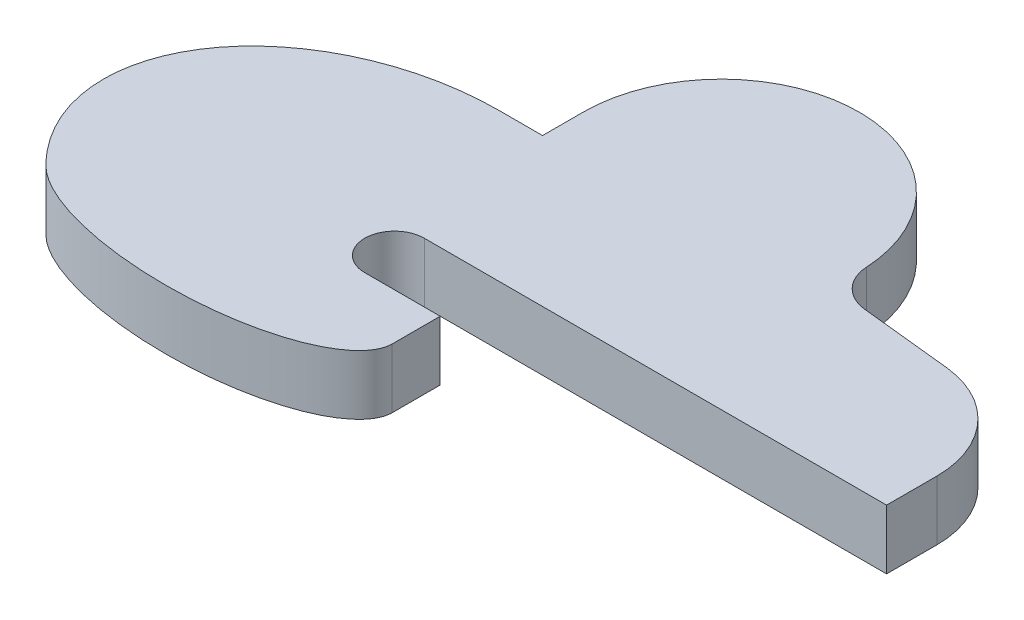
ISO-10303-21;
HEADER;
FILE_DESCRIPTION(('STEP AP214'),'2;1');
FILE_NAME('part.step','',(''),(''),'','','');
FILE_SCHEMA(('AUTOMOTIVE_DESIGN { 1 0 10303 214 1 1 1 1 }'));
ENDSEC;
DATA;
#1=APPLICATION_CONTEXT('core data for automotive mechanical design processes');
#2=APPLICATION_PROTOCOL_DEFINITION('international standard','automotive_design',2000,#1);
#3=PRODUCT_CONTEXT('',#1,'mechanical');
#4=PRODUCT('Part','Part','',(#3));
#5=PRODUCT_RELATED_PRODUCT_CATEGORY('part','',(#4));
#6=PRODUCT_DEFINITION_FORMATION('','',#4);
#7=PRODUCT_DEFINITION_CONTEXT('part definition',#1,'design');
#8=PRODUCT_DEFINITION('design','',#6,#7);
#9=PRODUCT_DEFINITION_SHAPE('','',#8);
#10=(LENGTH_UNIT() NAMED_UNIT(*) SI_UNIT(.MILLI.,.METRE.));
#11=(NAMED_UNIT(*) PLANE_ANGLE_UNIT() SI_UNIT($,.RADIAN.));
#12=(NAMED_UNIT(*) SI_UNIT($,.STERADIAN.) SOLID_ANGLE_UNIT());
#13=UNCERTAINTY_MEASURE_WITH_UNIT(LENGTH_MEASURE(1.E-05),#10,'distance_accuracy_value','');
#14=(GEOMETRIC_REPRESENTATION_CONTEXT(3) GLOBAL_UNCERTAINTY_ASSIGNED_CONTEXT((#13)) GLOBAL_UNIT_ASSIGNED_CONTEXT((#10,
#11,#12)) REPRESENTATION_CONTEXT('',''));
#15=CARTESIAN_POINT('',(0.,0.,0.));
#16=DIRECTION('',(0.,0.,1.));
#17=DIRECTION('',(1.,0.,0.));
#18=AXIS2_PLACEMENT_3D('',#15,#16,#17);
#19=CARTESIAN_POINT('',(0.,3.,2.42106019412781));
#20=DIRECTION('',(-1.,0.,0.));
#21=DIRECTION('',(0.,0.,1.));
#22=AXIS2_PLACEMENT_3D('',#19,#20,#21);
#23=PLANE('',#22);
#24=DIRECTION('',(0.,0.,-1.));
#25=VECTOR('',#24,1.);
#26=CARTESIAN_POINT('',(0.,0.,2.42106019412781));
#27=LINE('',#26,#25);
#28=CARTESIAN_POINT('',(0.,0.,2.42106019412781));
#29=VERTEX_POINT('',#28);
#30=CARTESIAN_POINT('',(0.,0.,0.));
#31=VERTEX_POINT('',#30);
#32=EDGE_CURVE('E215',#29,#31,#27,.T.);
#33=ORIENTED_EDGE('',*,*,#32,.T.);
#34=DIRECTION('',(0.,-1.,0.));
#35=VECTOR('',#34,1.);
#36=CARTESIAN_POINT('',(0.,3.,0.));
#37=LINE('',#36,#35);
#38=CARTESIAN_POINT('',(0.,3.,0.));
#39=VERTEX_POINT('',#38);
#40=EDGE_CURVE('E11',#39,#31,#37,.T.);
#41=ORIENTED_EDGE('',*,*,#40,.F.);
#42=DIRECTION('',(0.,0.,-1.));
#43=VECTOR('',#42,1.);
#44=CARTESIAN_POINT('',(0.,3.,2.42106019412781));
#45=LINE('',#44,#43);
#46=CARTESIAN_POINT('',(0.,3.,2.42106019412781));
#47=VERTEX_POINT('',#46);
#48=EDGE_CURVE('E243',#47,#39,#45,.T.);
#49=ORIENTED_EDGE('',*,*,#48,.F.);
#50=DIRECTION('',(0.,-1.,0.));
#51=VECTOR('',#50,1.);
#52=CARTESIAN_POINT('',(0.,3.,2.42106019412781));
#53=LINE('',#52,#51);
#54=EDGE_CURVE('E155',#47,#29,#53,.T.);
#55=ORIENTED_EDGE('',*,*,#54,.T.);
#56=EDGE_LOOP('',(#33,#41,#49,#55));
#57=FACE_BOUND('',#56,.T.);
#58=ADVANCED_FACE('F33',(#57),#23,.F.);
#59=CARTESIAN_POINT('',(0.,3.,0.));
#60=DIRECTION('',(0.,0.,1.));
#61=DIRECTION('',(1.,0.,0.));
#62=AXIS2_PLACEMENT_3D('',#59,#60,#61);
#63=PLANE('',#62);
#64=DIRECTION('',(-1.,0.,0.));
#65=VECTOR('',#64,1.);
#66=CARTESIAN_POINT('',(0.,0.,0.));
#67=LINE('',#66,#65);
#68=CARTESIAN_POINT('',(-3.8,0.,0.));
#69=VERTEX_POINT('',#68);
#70=EDGE_CURVE('E206',#31,#69,#67,.T.);
#71=ORIENTED_EDGE('',*,*,#70,.T.);
#72=DIRECTION('',(0.,-1.,0.));
#73=VECTOR('',#72,1.);
#74=CARTESIAN_POINT('',(-3.8,3.,0.));
#75=LINE('',#74,#73);
#76=CARTESIAN_POINT('',(-3.8,3.,0.));
#77=VERTEX_POINT('',#76);
#78=EDGE_CURVE('E41',#77,#69,#75,.T.);
#79=ORIENTED_EDGE('',*,*,#78,.F.);
#80=DIRECTION('',(-1.,0.,0.));
#81=VECTOR('',#80,1.);
#82=CARTESIAN_POINT('',(0.,3.,0.));
#83=LINE('',#82,#81);
#84=EDGE_CURVE('E107',#39,#77,#83,.T.);
#85=ORIENTED_EDGE('',*,*,#84,.F.);
#86=ORIENTED_EDGE('',*,*,#40,.T.);
#87=EDGE_LOOP('',(#71,#79,#85,#86));
#88=FACE_BOUND('',#87,.T.);
#89=ADVANCED_FACE('F199',(#88),#63,.F.);
#90=CARTESIAN_POINT('',(-3.8,3.,-1.5));
#91=DIRECTION('',(0.,-1.,0.));
#92=DIRECTION('',(0.,0.,-1.));
#93=AXIS2_PLACEMENT_3D('',#90,#91,#92);
#94=CYLINDRICAL_SURFACE('',#93,1.5);
#95=CARTESIAN_POINT('',(-3.8,0.,-1.5));
#96=DIRECTION('',(0.,-1.,0.));
#97=DIRECTION('',(0.,0.,-1.));
#98=AXIS2_PLACEMENT_3D('',#95,#96,#97);
#99=CIRCLE('',#98,1.5);
#100=CARTESIAN_POINT('',(-3.8,0.,-3.));
#101=VERTEX_POINT('',#100);
#102=EDGE_CURVE('E214',#69,#101,#99,.T.);
#103=ORIENTED_EDGE('',*,*,#102,.T.);
#104=DIRECTION('',(0.,-1.,0.));
#105=VECTOR('',#104,1.);
#106=CARTESIAN_POINT('',(-3.8,3.,-3.));
#107=LINE('',#106,#105);
#108=CARTESIAN_POINT('',(-3.8,3.,-3.));
#109=VERTEX_POINT('',#108);
#110=EDGE_CURVE('E220',#109,#101,#107,.T.);
#111=ORIENTED_EDGE('',*,*,#110,.F.);
#112=CARTESIAN_POINT('',(-3.8,3.,-1.5));
#113=DIRECTION('',(0.,-1.,0.));
#114=DIRECTION('',(0.,0.,-1.));
#115=AXIS2_PLACEMENT_3D('',#112,#113,#114);
#116=CIRCLE('',#115,1.5);
#117=EDGE_CURVE('E219',#77,#109,#116,.T.);
#118=ORIENTED_EDGE('',*,*,#117,.F.);
#119=ORIENTED_EDGE('',*,*,#78,.T.);
#120=EDGE_LOOP('',(#103,#111,#118,#119));
#121=FACE_BOUND('',#120,.T.);
#122=ADVANCED_FACE('F196',(#121),#94,.F.);
#123=CARTESIAN_POINT('',(-3.8,3.,-3.));
#124=DIRECTION('',(0.,0.,-1.));
#125=DIRECTION('',(-1.,0.,0.));
#126=AXIS2_PLACEMENT_3D('',#123,#124,#125);
#127=PLANE('',#126);
#128=DIRECTION('',(1.,0.,0.));
#129=VECTOR('',#128,1.);
#130=CARTESIAN_POINT('',(-3.8,0.,-3.));
#131=LINE('',#130,#129);
#132=CARTESIAN_POINT('',(19.47,0.,-3.));
#133=VERTEX_POINT('',#132);
#134=EDGE_CURVE('E224',#101,#133,#131,.T.);
#135=ORIENTED_EDGE('',*,*,#134,.T.);
#136=DIRECTION('',(0.,-1.,0.));
#137=VECTOR('',#136,1.);
#138=CARTESIAN_POINT('',(19.47,3.,-3.));
#139=LINE('',#138,#137);
#140=CARTESIAN_POINT('',(19.47,3.,-3.));
#141=VERTEX_POINT('',#140);
#142=EDGE_CURVE('E262',#141,#133,#139,.T.);
#143=ORIENTED_EDGE('',*,*,#142,.F.);
#144=DIRECTION('',(1.,0.,0.));
#145=VECTOR('',#144,1.);
#146=CARTESIAN_POINT('',(-3.8,3.,-3.));
#147=LINE('',#146,#145);
#148=EDGE_CURVE('E267',#109,#141,#147,.T.);
#149=ORIENTED_EDGE('',*,*,#148,.F.);
#150=ORIENTED_EDGE('',*,*,#110,.T.);
#151=EDGE_LOOP('',(#135,#143,#149,#150));
#152=FACE_BOUND('',#151,.T.);
#153=ADVANCED_FACE('F192',(#152),#127,.F.);
#154=CARTESIAN_POINT('',(19.47,3.,-3.));
#155=DIRECTION('',(-1.,0.,0.));
#156=DIRECTION('',(0.,0.,1.));
#157=AXIS2_PLACEMENT_3D('',#154,#155,#156);
#158=PLANE('',#157);
#159=DIRECTION('',(0.,0.,-1.));
#160=VECTOR('',#159,1.);
#161=CARTESIAN_POINT('',(19.47,0.,-3.));
#162=LINE('',#161,#160);
#163=CARTESIAN_POINT('',(19.47,0.,-5.53113056743434));
#164=VERTEX_POINT('',#163);
#165=EDGE_CURVE('E226',#133,#164,#162,.T.);
#166=ORIENTED_EDGE('',*,*,#165,.T.);
#167=DIRECTION('',(0.,-1.,0.));
#168=VECTOR('',#167,1.);
#169=CARTESIAN_POINT('',(19.47,3.,-5.53113056743434));
#170=LINE('',#169,#168);
#171=CARTESIAN_POINT('',(19.47,3.,-5.53113056743434));
#172=VERTEX_POINT('',#171);
#173=EDGE_CURVE('E259',#172,#164,#170,.T.);
#174=ORIENTED_EDGE('',*,*,#173,.F.);
#175=DIRECTION('',(0.,0.,-1.));
#176=VECTOR('',#175,1.);
#177=CARTESIAN_POINT('',(19.47,3.,-3.));
#178=LINE('',#177,#176);
#179=EDGE_CURVE('E269',#141,#172,#178,.T.);
#180=ORIENTED_EDGE('',*,*,#179,.F.);
#181=ORIENTED_EDGE('',*,*,#142,.T.);
#182=EDGE_LOOP('',(#166,#174,#180,#181));
#183=FACE_BOUND('',#182,.T.);
#184=ADVANCED_FACE('F188',(#183),#158,.F.);
#185=CARTESIAN_POINT('',(14.47,3.,-5.53113056743434));
#186=DIRECTION('',(0.,-1.,0.));
#187=DIRECTION('',(0.,0.,-1.));
#188=AXIS2_PLACEMENT_3D('',#185,#186,#187);
#189=CYLINDRICAL_SURFACE('',#188,5.);
#190=CARTESIAN_POINT('',(14.47,0.,-5.53113056743434));
#191=DIRECTION('',(0.,1.,0.));
#192=DIRECTION('',(0.,0.,1.));
#193=AXIS2_PLACEMENT_3D('',#190,#191,#192);
#194=CIRCLE('',#193,5.);
#195=CARTESIAN_POINT('',(14.9926423163383,0.,-10.5037400442757));
#196=VERTEX_POINT('',#195);
#197=EDGE_CURVE('E230',#164,#196,#194,.T.);
#198=ORIENTED_EDGE('',*,*,#197,.T.);
#199=DIRECTION('',(0.,-1.,0.));
#200=VECTOR('',#199,1.);
#201=CARTESIAN_POINT('',(14.9926423163383,3.,-10.5037400442757));
#202=LINE('',#201,#200);
#203=CARTESIAN_POINT('',(14.9926423163383,3.,-10.5037400442757));
#204=VERTEX_POINT('',#203);
#205=EDGE_CURVE('E256',#204,#196,#202,.T.);
#206=ORIENTED_EDGE('',*,*,#205,.F.);
#207=CARTESIAN_POINT('',(14.47,3.,-5.53113056743434));
#208=DIRECTION('',(0.,1.,0.));
#209=DIRECTION('',(0.,0.,1.));
#210=AXIS2_PLACEMENT_3D('',#207,#208,#209);
#211=CIRCLE('',#210,5.);
#212=EDGE_CURVE('E271',#172,#204,#211,.T.);
#213=ORIENTED_EDGE('',*,*,#212,.F.);
#214=ORIENTED_EDGE('',*,*,#173,.T.);
#215=EDGE_LOOP('',(#198,#206,#213,#214));
#216=FACE_BOUND('',#215,.T.);
#217=ADVANCED_FACE('F184',(#216),#189,.T.);
#218=CARTESIAN_POINT('',(10.377958193064,3.,-10.9887628900451));
#219=DIRECTION('',(-0.104528463267653,0.,0.994521895368273));
#220=DIRECTION('',(0.994521895368273,0.,0.104528463267653));
#221=AXIS2_PLACEMENT_3D('',#218,#219,#220);
#222=PLANE('',#221);
#223=DIRECTION('',(-0.994521895368273,0.,-0.104528463267653));
#224=VECTOR('',#223,1.);
#225=CARTESIAN_POINT('',(10.377958193064,0.,-10.9887628900451));
#226=LINE('',#225,#224);
#227=CARTESIAN_POINT('',(10.377958193064,0.,-10.9887628900451));
#228=VERTEX_POINT('',#227);
#229=EDGE_CURVE('E232',#196,#228,#226,.T.);
#230=ORIENTED_EDGE('',*,*,#229,.T.);
#231=DIRECTION('',(0.,-1.,0.));
#232=VECTOR('',#231,1.);
#233=CARTESIAN_POINT('',(10.377958193064,3.,-10.9887628900451));
#234=LINE('',#233,#232);
#235=CARTESIAN_POINT('',(10.377958193064,3.,-10.9887628900451));
#236=VERTEX_POINT('',#235);
#237=EDGE_CURVE('E253',#236,#228,#234,.T.);
#238=ORIENTED_EDGE('',*,*,#237,.F.);
#239=DIRECTION('',(-0.994521895368273,0.,-0.104528463267653));
#240=VECTOR('',#239,1.);
#241=CARTESIAN_POINT('',(10.377958193064,3.,-10.9887628900451));
#242=LINE('',#241,#240);
#243=EDGE_CURVE('E277',#204,#236,#242,.T.);
#244=ORIENTED_EDGE('',*,*,#243,.F.);
#245=ORIENTED_EDGE('',*,*,#205,.T.);
#246=EDGE_LOOP('',(#230,#238,#244,#245));
#247=FACE_BOUND('',#246,.T.);
#248=ADVANCED_FACE('F180',(#247),#222,.F.);
#249=CARTESIAN_POINT('',(10.5870151195993,3.,-12.9778066807817));
#250=DIRECTION('',(0.,-1.,0.));
#251=DIRECTION('',(0.,0.,-1.));
#252=AXIS2_PLACEMENT_3D('',#249,#250,#251);
#253=CYLINDRICAL_SURFACE('',#252,2.);
#254=CARTESIAN_POINT('',(10.5870151195993,0.,-12.9778066807817));
#255=DIRECTION('',(0.,-1.,0.));
#256=DIRECTION('',(0.,0.,1.));
#257=AXIS2_PLACEMENT_3D('',#254,#255,#256);
#258=CIRCLE('',#257,2.);
#259=CARTESIAN_POINT('',(8.58991676885085,0.,-12.8701118460038));
#260=VERTEX_POINT('',#259);
#261=EDGE_CURVE('E234',#228,#260,#258,.T.);
#262=ORIENTED_EDGE('',*,*,#261,.T.);
#263=DIRECTION('',(0.,-1.,0.));
#264=VECTOR('',#263,1.);
#265=CARTESIAN_POINT('',(8.58991676885085,3.,-12.8701118460038));
#266=LINE('',#265,#264);
#267=CARTESIAN_POINT('',(8.58991676885085,3.,-12.8701118460038));
#268=VERTEX_POINT('',#267);
#269=EDGE_CURVE('E250',#268,#260,#266,.T.);
#270=ORIENTED_EDGE('',*,*,#269,.F.);
#271=CARTESIAN_POINT('',(10.5870151195993,3.,-12.9778066807817));
#272=DIRECTION('',(0.,-1.,0.));
#273=DIRECTION('',(0.,0.,1.));
#274=AXIS2_PLACEMENT_3D('',#271,#272,#273);
#275=CIRCLE('',#274,2.);
#276=EDGE_CURVE('E279',#236,#268,#275,.T.);
#277=ORIENTED_EDGE('',*,*,#276,.F.);
#278=ORIENTED_EDGE('',*,*,#237,.T.);
#279=EDGE_LOOP('',(#262,#270,#277,#278));
#280=FACE_BOUND('',#279,.T.);
#281=ADVANCED_FACE('F176',(#280),#253,.F.);
#282=CARTESIAN_POINT('',(1.65,3.,-12.4958722951506));
#283=DIRECTION('',(0.,-1.,0.));
#284=DIRECTION('',(0.,0.,-1.));
#285=AXIS2_PLACEMENT_3D('',#282,#283,#284);
#286=CYLINDRICAL_SURFACE('',#285,6.95);
#287=CARTESIAN_POINT('',(1.65,0.,-12.4958722951506));
#288=DIRECTION('',(0.,1.,0.));
#289=DIRECTION('',(0.,0.,-1.));
#290=AXIS2_PLACEMENT_3D('',#287,#288,#289);
#291=CIRCLE('',#290,6.95);
#292=CARTESIAN_POINT('',(-5.3,0.,-12.4958722951506));
#293=VERTEX_POINT('',#292);
#294=EDGE_CURVE('E236',#260,#293,#291,.T.);
#295=ORIENTED_EDGE('',*,*,#294,.T.);
#296=DIRECTION('',(0.,-1.,0.));
#297=VECTOR('',#296,1.);
#298=CARTESIAN_POINT('',(-5.3,3.,-12.4958722951506));
#299=LINE('',#298,#297);
#300=CARTESIAN_POINT('',(-5.3,3.,-12.4958722951506));
#301=VERTEX_POINT('',#300);
#302=EDGE_CURVE('E247',#301,#293,#299,.T.);
#303=ORIENTED_EDGE('',*,*,#302,.F.);
#304=CARTESIAN_POINT('',(1.65,3.,-12.4958722951506));
#305=DIRECTION('',(0.,1.,0.));
#306=DIRECTION('',(0.,0.,-1.));
#307=AXIS2_PLACEMENT_3D('',#304,#305,#306);
#308=CIRCLE('',#307,6.95);
#309=EDGE_CURVE('E281',#268,#301,#308,.T.);
#310=ORIENTED_EDGE('',*,*,#309,.F.);
#311=ORIENTED_EDGE('',*,*,#269,.T.);
#312=EDGE_LOOP('',(#295,#303,#310,#311));
#313=FACE_BOUND('',#312,.T.);
#314=ADVANCED_FACE('F172',(#313),#286,.T.);
#315=CARTESIAN_POINT('',(-5.3,3.,-10.452302322473));
#316=DIRECTION('',(1.,0.,0.));
#317=DIRECTION('',(0.,0.,-1.));
#318=AXIS2_PLACEMENT_3D('',#315,#316,#317);
#319=PLANE('',#318);
#320=DIRECTION('',(0.,0.,1.));
#321=VECTOR('',#320,1.);
#322=CARTESIAN_POINT('',(-5.3,0.,-10.452302322473));
#323=LINE('',#322,#321);
#324=CARTESIAN_POINT('',(-5.3,0.,-10.452302322473));
#325=VERTEX_POINT('',#324);
#326=EDGE_CURVE('E238',#293,#325,#323,.T.);
#327=ORIENTED_EDGE('',*,*,#326,.T.);
#328=DIRECTION('',(0.,-1.,0.));
#329=VECTOR('',#328,1.);
#330=CARTESIAN_POINT('',(-5.3,3.,-10.452302322473));
#331=LINE('',#330,#329);
#332=CARTESIAN_POINT('',(-5.3,3.,-10.452302322473));
#333=VERTEX_POINT('',#332);
#334=EDGE_CURVE('E150',#333,#325,#331,.T.);
#335=ORIENTED_EDGE('',*,*,#334,.F.);
#336=DIRECTION('',(0.,0.,1.));
#337=VECTOR('',#336,1.);
#338=CARTESIAN_POINT('',(-5.3,3.,-10.452302322473));
#339=LINE('',#338,#337);
#340=EDGE_CURVE('E141',#301,#333,#339,.T.);
#341=ORIENTED_EDGE('',*,*,#340,.F.);
#342=ORIENTED_EDGE('',*,*,#302,.T.);
#343=EDGE_LOOP('',(#327,#335,#341,#342));
#344=FACE_BOUND('',#343,.T.);
#345=ADVANCED_FACE('F169',(#344),#319,.F.);
#346=CARTESIAN_POINT('',(-5.3,3.,-10.452302322473));
#347=DIRECTION('',(0.,0.,1.));
#348=DIRECTION('',(1.,0.,0.));
#349=AXIS2_PLACEMENT_3D('',#346,#347,#348);
#350=PLANE('',#349);
#351=DIRECTION('',(-1.,0.,0.));
#352=VECTOR('',#351,1.);
#353=CARTESIAN_POINT('',(-5.3,0.,-10.452302322473));
#354=LINE('',#353,#352);
#355=CARTESIAN_POINT('',(-7.46587105744452,0.,-10.452302322473));
#356=VERTEX_POINT('',#355);
#357=EDGE_CURVE('E149',#325,#356,#354,.T.);
#358=ORIENTED_EDGE('',*,*,#357,.T.);
#359=DIRECTION('',(0.,-1.,0.));
#360=VECTOR('',#359,1.);
#361=CARTESIAN_POINT('',(-7.46587105744452,3.,-10.452302322473));
#362=LINE('',#361,#360);
#363=CARTESIAN_POINT('',(-7.46587105744452,3.,-10.452302322473));
#364=VERTEX_POINT('',#363);
#365=EDGE_CURVE('E146',#364,#356,#362,.T.);
#366=ORIENTED_EDGE('',*,*,#365,.F.);
#367=DIRECTION('',(-1.,0.,0.));
#368=VECTOR('',#367,1.);
#369=CARTESIAN_POINT('',(-5.3,3.,-10.452302322473));
#370=LINE('',#369,#368);
#371=EDGE_CURVE('E135',#333,#364,#370,.T.);
#372=ORIENTED_EDGE('',*,*,#371,.F.);
#373=ORIENTED_EDGE('',*,*,#334,.T.);
#374=EDGE_LOOP('',(#358,#366,#372,#373));
#375=FACE_BOUND('',#374,.T.);
#376=ADVANCED_FACE('F147',(#375),#350,.F.);
#377=CARTESIAN_POINT('',(-7.46587105744453,3.,-1.85730232247301));
#378=DIRECTION('',(0.,1.,0.));
#379=DIRECTION('',(1.,0.,0.));
#380=AXIS2_PLACEMENT_3D('',#377,#378,#379);
#381=ELLIPSE('',#380,11.35,8.595);
#382=DIRECTION('',(0.,-1.,0.));
#383=VECTOR('',#382,1.);
#384=SURFACE_OF_LINEAR_EXTRUSION('',#381,#383);
#385=CARTESIAN_POINT('',(-7.46587105744453,0.,-1.85730232247301));
#386=DIRECTION('',(0.,1.,0.));
#387=DIRECTION('',(1.,0.,0.));
#388=AXIS2_PLACEMENT_3D('',#385,#386,#387);
#389=ELLIPSE('',#388,11.35,8.595);
#390=CARTESIAN_POINT('',(-16.4181329400112,0.,3.42621463902196));
#391=VERTEX_POINT('',#390);
#392=EDGE_CURVE('E93',#356,#391,#389,.T.);
#393=ORIENTED_EDGE('',*,*,#392,.T.);
#394=DIRECTION('',(0.,-1.,0.));
#395=VECTOR('',#394,1.);
#396=CARTESIAN_POINT('',(-16.4181329400112,3.,3.42621463902196));
#397=LINE('',#396,#395);
#398=CARTESIAN_POINT('',(-16.4181329400112,3.,3.42621463902196));
#399=VERTEX_POINT('',#398);
#400=EDGE_CURVE('E151',#399,#391,#397,.T.);
#401=ORIENTED_EDGE('',*,*,#400,.F.);
#402=EDGE_CURVE('E139',#364,#399,#381,.T.);
#403=ORIENTED_EDGE('',*,*,#402,.F.);
#404=ORIENTED_EDGE('',*,*,#365,.T.);
#405=EDGE_LOOP('',(#393,#401,#403,#404));
#406=FACE_BOUND('',#405,.T.);
#407=ADVANCED_FACE('F153',(#406),#384,.F.);
#408=CARTESIAN_POINT('',(-8.50844645610224,3.,2.31548893787027));
#409=DIRECTION('',(0.,1.,0.));
#410=DIRECTION('',(0.999923031911579,0.,0.0124068631311708));
#411=AXIS2_PLACEMENT_3D('',#408,#409,#410);
#412=ELLIPSE('',#411,8.50910138537006,3.24140951718288);
#413=DIRECTION('',(0.,-1.,0.));
#414=VECTOR('',#413,1.);
#415=SURFACE_OF_LINEAR_EXTRUSION('',#412,#414);
#416=CARTESIAN_POINT('',(-8.50844645610224,0.,2.31548893787027));
#417=DIRECTION('',(0.,1.,0.));
#418=DIRECTION('',(0.999923031911579,0.,0.0124068631311708));
#419=AXIS2_PLACEMENT_3D('',#416,#417,#418);
#420=ELLIPSE('',#419,8.50910138537006,3.24140951718288);
#421=EDGE_CURVE('E99',#391,#29,#420,.T.);
#422=ORIENTED_EDGE('',*,*,#421,.T.);
#423=ORIENTED_EDGE('',*,*,#54,.F.);
#424=EDGE_CURVE('E49',#399,#47,#412,.T.);
#425=ORIENTED_EDGE('',*,*,#424,.F.);
#426=ORIENTED_EDGE('',*,*,#400,.T.);
#427=EDGE_LOOP('',(#422,#423,#425,#426));
#428=FACE_BOUND('',#427,.T.);
#429=ADVANCED_FACE('F165',(#428),#415,.F.);
#430=CARTESIAN_POINT('',(-7.46587105744453,3.,-1.85730232247301));
#431=DIRECTION('',(0.,1.,0.));
#432=DIRECTION('',(0.,0.,1.));
#433=AXIS2_PLACEMENT_3D('',#430,#431,#432);
#434=PLANE('',#433);
#435=ORIENTED_EDGE('',*,*,#48,.T.);
#436=ORIENTED_EDGE('',*,*,#84,.T.);
#437=ORIENTED_EDGE('',*,*,#117,.T.);
#438=ORIENTED_EDGE('',*,*,#148,.T.);
#439=ORIENTED_EDGE('',*,*,#179,.T.);
#440=ORIENTED_EDGE('',*,*,#212,.T.);
#441=ORIENTED_EDGE('',*,*,#243,.T.);
#442=ORIENTED_EDGE('',*,*,#276,.T.);
#443=ORIENTED_EDGE('',*,*,#309,.T.);
#444=ORIENTED_EDGE('',*,*,#340,.T.);
#445=ORIENTED_EDGE('',*,*,#371,.T.);
#446=ORIENTED_EDGE('',*,*,#402,.T.);
#447=ORIENTED_EDGE('',*,*,#424,.T.);
#448=EDGE_LOOP('',(#435,#436,#437,#438,#439,#440,#441,#442,#443,#444,#445,#446,#447));
#449=FACE_BOUND('',#448,.T.);
#450=ADVANCED_FACE('F137',(#449),#434,.T.);
#451=CARTESIAN_POINT('',(-7.46587105744453,0.,-1.85730232247301));
#452=DIRECTION('',(0.,1.,0.));
#453=DIRECTION('',(0.,0.,1.));
#454=AXIS2_PLACEMENT_3D('',#451,#452,#453);
#455=PLANE('',#454);
#456=ORIENTED_EDGE('',*,*,#32,.F.);
#457=ORIENTED_EDGE('',*,*,#421,.F.);
#458=ORIENTED_EDGE('',*,*,#392,.F.);
#459=ORIENTED_EDGE('',*,*,#357,.F.);
#460=ORIENTED_EDGE('',*,*,#326,.F.);
#461=ORIENTED_EDGE('',*,*,#294,.F.);
#462=ORIENTED_EDGE('',*,*,#261,.F.);
#463=ORIENTED_EDGE('',*,*,#229,.F.);
#464=ORIENTED_EDGE('',*,*,#197,.F.);
#465=ORIENTED_EDGE('',*,*,#165,.F.);
#466=ORIENTED_EDGE('',*,*,#134,.F.);
#467=ORIENTED_EDGE('',*,*,#102,.F.);
#468=ORIENTED_EDGE('',*,*,#70,.F.);
#469=EDGE_LOOP('',(#456,#457,#458,#459,#460,#461,#462,#463,#464,#465,#466,#467,#468));
#470=FACE_BOUND('',#469,.T.);
#471=ADVANCED_FACE('F222',(#470),#455,.F.);
#472=CLOSED_SHELL('',(#58,#89,#122,#153,#184,#217,#248,#281,#314,#345,#376,#407,#429,#450,#471));
#473=MANIFOLD_SOLID_BREP('B2',#472);
#474=ADVANCED_BREP_SHAPE_REPRESENTATION('',(#18,#473),#14);
#475=SHAPE_DEFINITION_REPRESENTATION(#9,#474);
ENDSEC;
END-ISO-10303-21;
